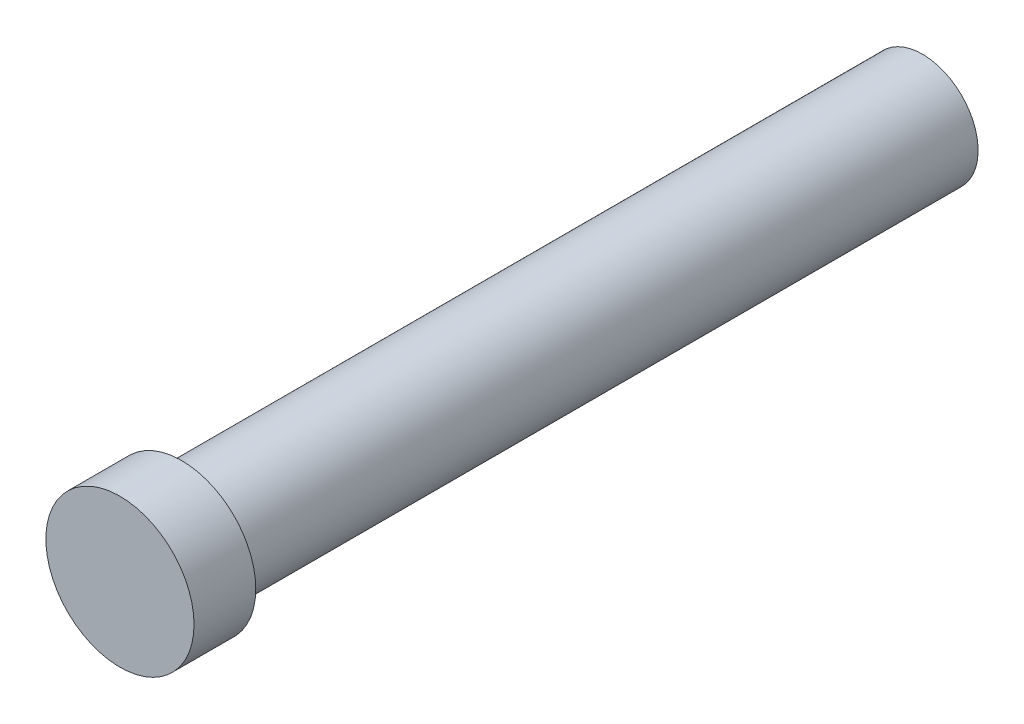
ISO-10303-21;
HEADER;
FILE_DESCRIPTION(('STEP AP214'),'2;1');
FILE_NAME('part.step','',(''),(''),'','','');
FILE_SCHEMA(('AUTOMOTIVE_DESIGN { 1 0 10303 214 1 1 1 1 }'));
ENDSEC;
DATA;
#1=APPLICATION_CONTEXT('core data for automotive mechanical design processes');
#2=APPLICATION_PROTOCOL_DEFINITION('international standard','automotive_design',2000,#1);
#3=PRODUCT_CONTEXT('',#1,'mechanical');
#4=PRODUCT('Part','Part','',(#3));
#5=PRODUCT_RELATED_PRODUCT_CATEGORY('part','',(#4));
#6=PRODUCT_DEFINITION_FORMATION('','',#4);
#7=PRODUCT_DEFINITION_CONTEXT('part definition',#1,'design');
#8=PRODUCT_DEFINITION('design','',#6,#7);
#9=PRODUCT_DEFINITION_SHAPE('','',#8);
#10=(LENGTH_UNIT() NAMED_UNIT(*) SI_UNIT(.MILLI.,.METRE.));
#11=(NAMED_UNIT(*) PLANE_ANGLE_UNIT() SI_UNIT($,.RADIAN.));
#12=(NAMED_UNIT(*) SI_UNIT($,.STERADIAN.) SOLID_ANGLE_UNIT());
#13=UNCERTAINTY_MEASURE_WITH_UNIT(LENGTH_MEASURE(1.E-05),#10,'distance_accuracy_value','');
#14=(GEOMETRIC_REPRESENTATION_CONTEXT(3) GLOBAL_UNCERTAINTY_ASSIGNED_CONTEXT((#13)) GLOBAL_UNIT_ASSIGNED_CONTEXT((#10,
#11,#12)) REPRESENTATION_CONTEXT('',''));
#15=CARTESIAN_POINT('',(0.,0.,0.));
#16=DIRECTION('',(0.,0.,1.));
#17=DIRECTION('',(1.,0.,0.));
#18=AXIS2_PLACEMENT_3D('',#15,#16,#17);
#19=CARTESIAN_POINT('',(0.,0.,5.));
#20=DIRECTION('',(0.,0.,-1.));
#21=DIRECTION('',(-1.,0.,0.));
#22=AXIS2_PLACEMENT_3D('',#19,#20,#21);
#23=CYLINDRICAL_SURFACE('',#22,6.);
#24=CARTESIAN_POINT('',(0.,0.,5.));
#25=DIRECTION('',(0.,0.,1.));
#26=DIRECTION('',(1.,0.,0.));
#27=AXIS2_PLACEMENT_3D('',#24,#25,#26);
#28=CIRCLE('',#27,6.);
#29=CARTESIAN_POINT('',(6.,0.,5.));
#30=VERTEX_POINT('',#29);
#31=EDGE_CURVE('E49',#30,#30,#28,.T.);
#32=ORIENTED_EDGE('',*,*,#31,.F.);
#33=EDGE_LOOP('',(#32));
#34=FACE_BOUND('',#33,.T.);
#35=CARTESIAN_POINT('',(0.,0.,0.));
#36=DIRECTION('',(0.,0.,1.));
#37=DIRECTION('',(1.,0.,0.));
#38=AXIS2_PLACEMENT_3D('',#35,#36,#37);
#39=CIRCLE('',#38,6.);
#40=CARTESIAN_POINT('',(6.,0.,0.));
#41=VERTEX_POINT('',#40);
#42=EDGE_CURVE('E44',#41,#41,#39,.T.);
#43=ORIENTED_EDGE('',*,*,#42,.T.);
#44=EDGE_LOOP('',(#43));
#45=FACE_BOUND('',#44,.T.);
#46=ADVANCED_FACE('F41',(#34,#45),#23,.T.);
#47=CARTESIAN_POINT('',(0.,0.,5.));
#48=DIRECTION('',(0.,0.,1.));
#49=DIRECTION('',(1.,0.,0.));
#50=AXIS2_PLACEMENT_3D('',#47,#48,#49);
#51=PLANE('',#50);
#52=ORIENTED_EDGE('',*,*,#31,.T.);
#53=EDGE_LOOP('',(#52));
#54=FACE_BOUND('',#53,.T.);
#55=ADVANCED_FACE('F69',(#54),#51,.T.);
#56=CARTESIAN_POINT('',(0.,0.,0.));
#57=DIRECTION('',(0.,0.,1.));
#58=DIRECTION('',(1.,0.,0.));
#59=AXIS2_PLACEMENT_3D('',#56,#57,#58);
#60=PLANE('',#59);
#61=CARTESIAN_POINT('',(0.,0.,0.));
#62=DIRECTION('',(0.,0.,-1.));
#63=DIRECTION('',(-1.,0.,0.));
#64=AXIS2_PLACEMENT_3D('',#61,#62,#63);
#65=CIRCLE('',#64,4.5);
#66=CARTESIAN_POINT('',(-4.5,0.,0.));
#67=VERTEX_POINT('',#66);
#68=EDGE_CURVE('E10',#67,#67,#65,.T.);
#69=ORIENTED_EDGE('',*,*,#68,.F.);
#70=EDGE_LOOP('',(#69));
#71=FACE_BOUND('',#70,.T.);
#72=ORIENTED_EDGE('',*,*,#42,.F.);
#73=EDGE_LOOP('',(#72));
#74=FACE_BOUND('',#73,.T.);
#75=ADVANCED_FACE('F66',(#71,#74),#60,.F.);
#76=CARTESIAN_POINT('',(0.,0.,-60.));
#77=DIRECTION('',(0.,0.,1.));
#78=DIRECTION('',(1.,0.,0.));
#79=AXIS2_PLACEMENT_3D('',#76,#77,#78);
#80=CYLINDRICAL_SURFACE('',#79,4.5);
#81=CARTESIAN_POINT('',(0.,0.,-60.));
#82=DIRECTION('',(0.,0.,-1.));
#83=DIRECTION('',(-1.,0.,0.));
#84=AXIS2_PLACEMENT_3D('',#81,#82,#83);
#85=CIRCLE('',#84,4.5);
#86=CARTESIAN_POINT('',(-4.5,0.,-60.));
#87=VERTEX_POINT('',#86);
#88=EDGE_CURVE('E56',#87,#87,#85,.T.);
#89=ORIENTED_EDGE('',*,*,#88,.F.);
#90=EDGE_LOOP('',(#89));
#91=FACE_BOUND('',#90,.T.);
#92=ORIENTED_EDGE('',*,*,#68,.T.);
#93=EDGE_LOOP('',(#92));
#94=FACE_BOUND('',#93,.T.);
#95=ADVANCED_FACE('F68',(#91,#94),#80,.T.);
#96=CARTESIAN_POINT('',(0.,0.,-60.));
#97=DIRECTION('',(0.,0.,-1.));
#98=DIRECTION('',(-1.,0.,0.));
#99=AXIS2_PLACEMENT_3D('',#96,#97,#98);
#100=PLANE('',#99);
#101=ORIENTED_EDGE('',*,*,#88,.T.);
#102=EDGE_LOOP('',(#101));
#103=FACE_BOUND('',#102,.T.);
#104=ADVANCED_FACE('F75',(#103),#100,.T.);
#105=CLOSED_SHELL('',(#46,#55,#75,#95,#104));
#106=MANIFOLD_SOLID_BREP('B2',#105);
#107=ADVANCED_BREP_SHAPE_REPRESENTATION('',(#18,#106),#14);
#108=SHAPE_DEFINITION_REPRESENTATION(#9,#107);
ENDSEC;
END-ISO-10303-21;
